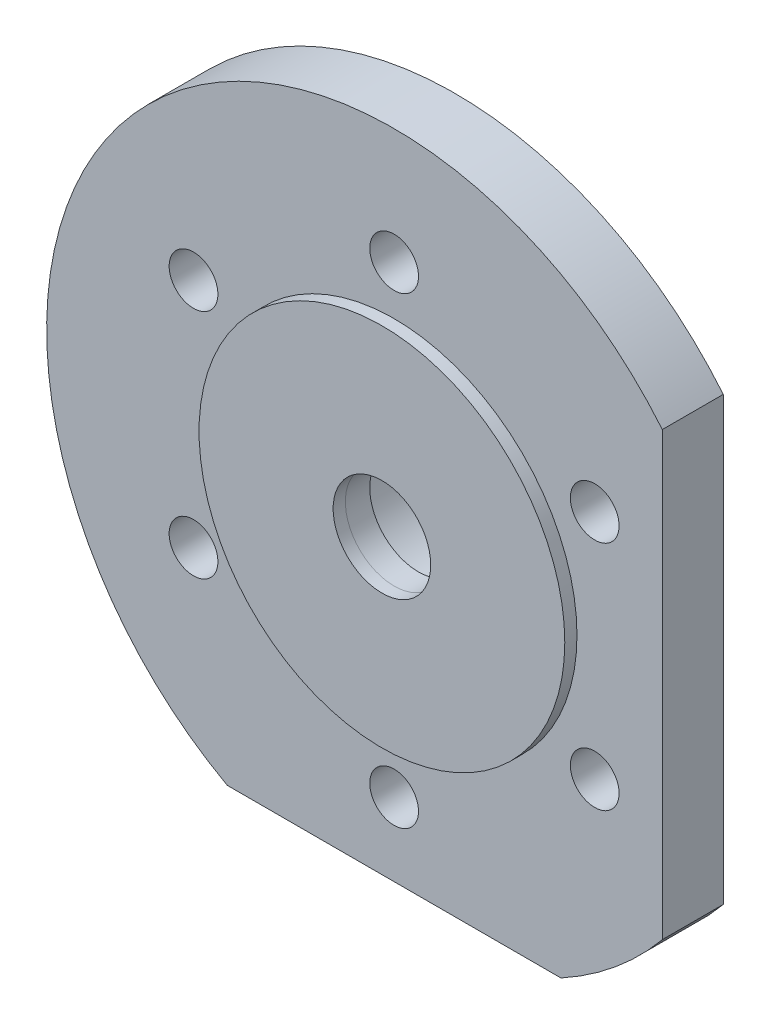
ISO-10303-21;
HEADER;
FILE_DESCRIPTION(('STEP AP214'),'2;1');
FILE_NAME('part.step','',(''),(''),'','','');
FILE_SCHEMA(('AUTOMOTIVE_DESIGN { 1 0 10303 214 1 1 1 1 }'));
ENDSEC;
DATA;
#1=APPLICATION_CONTEXT('core data for automotive mechanical design processes');
#2=APPLICATION_PROTOCOL_DEFINITION('international standard','automotive_design',2000,#1);
#3=PRODUCT_CONTEXT('',#1,'mechanical');
#4=PRODUCT('Part','Part','',(#3));
#5=PRODUCT_RELATED_PRODUCT_CATEGORY('part','',(#4));
#6=PRODUCT_DEFINITION_FORMATION('','',#4);
#7=PRODUCT_DEFINITION_CONTEXT('part definition',#1,'design');
#8=PRODUCT_DEFINITION('design','',#6,#7);
#9=PRODUCT_DEFINITION_SHAPE('','',#8);
#10=(LENGTH_UNIT() NAMED_UNIT(*) SI_UNIT(.MILLI.,.METRE.));
#11=(NAMED_UNIT(*) PLANE_ANGLE_UNIT() SI_UNIT($,.RADIAN.));
#12=(NAMED_UNIT(*) SI_UNIT($,.STERADIAN.) SOLID_ANGLE_UNIT());
#13=UNCERTAINTY_MEASURE_WITH_UNIT(LENGTH_MEASURE(1.E-05),#10,'distance_accuracy_value','');
#14=(GEOMETRIC_REPRESENTATION_CONTEXT(3) GLOBAL_UNCERTAINTY_ASSIGNED_CONTEXT((#13)) GLOBAL_UNIT_ASSIGNED_CONTEXT((#10,
#11,#12)) REPRESENTATION_CONTEXT('',''));
#15=CARTESIAN_POINT('',(0.,0.,0.));
#16=DIRECTION('',(0.,0.,1.));
#17=DIRECTION('',(1.,0.,0.));
#18=AXIS2_PLACEMENT_3D('',#15,#16,#17);
#19=CARTESIAN_POINT('',(0.,0.,-12.));
#20=DIRECTION('',(0.,0.,1.));
#21=DIRECTION('',(1.,0.,0.));
#22=AXIS2_PLACEMENT_3D('',#19,#20,#21);
#23=CYLINDRICAL_SURFACE('',#22,6.);
#24=CARTESIAN_POINT('',(0.,0.,-12.));
#25=DIRECTION('',(0.,0.,1.));
#26=DIRECTION('',(1.,0.,0.));
#27=AXIS2_PLACEMENT_3D('',#24,#25,#26);
#28=CIRCLE('',#27,6.);
#29=CARTESIAN_POINT('',(6.,0.,-12.));
#30=VERTEX_POINT('',#29);
#31=EDGE_CURVE('E244',#30,#30,#28,.T.);
#32=ORIENTED_EDGE('',*,*,#31,.F.);
#33=EDGE_LOOP('',(#32));
#34=FACE_BOUND('',#33,.T.);
#35=CARTESIAN_POINT('',(0.,0.,-2.));
#36=DIRECTION('',(0.,0.,1.));
#37=DIRECTION('',(1.,0.,0.));
#38=AXIS2_PLACEMENT_3D('',#35,#36,#37);
#39=CIRCLE('',#38,6.);
#40=CARTESIAN_POINT('',(6.,0.,-2.));
#41=VERTEX_POINT('',#40);
#42=EDGE_CURVE('E12',#41,#41,#39,.F.);
#43=ORIENTED_EDGE('',*,*,#42,.F.);
#44=EDGE_LOOP('',(#43));
#45=FACE_BOUND('',#44,.T.);
#46=ADVANCED_FACE('F46',(#34,#45),#23,.F.);
#47=CARTESIAN_POINT('',(0.,-25.,-5.));
#48=DIRECTION('',(0.,1.,0.));
#49=DIRECTION('',(0.,0.,1.));
#50=AXIS2_PLACEMENT_3D('',#47,#48,#49);
#51=PLANE('',#50);
#52=DIRECTION('',(-1.,0.,0.));
#53=VECTOR('',#52,1.);
#54=CARTESIAN_POINT('',(0.,-25.,0.));
#55=LINE('',#54,#53);
#56=CARTESIAN_POINT('',(13.683932183404,-25.,0.));
#57=VERTEX_POINT('',#56);
#58=CARTESIAN_POINT('',(-13.683932183404,-25.,0.));
#59=VERTEX_POINT('',#58);
#60=EDGE_CURVE('E132',#57,#59,#55,.T.);
#61=ORIENTED_EDGE('',*,*,#60,.T.);
#62=DIRECTION('',(0.,0.,1.));
#63=VECTOR('',#62,1.);
#64=CARTESIAN_POINT('',(-13.683932183404,-25.,-5.));
#65=LINE('',#64,#63);
#66=CARTESIAN_POINT('',(-13.683932183404,-25.,-5.));
#67=VERTEX_POINT('',#66);
#68=EDGE_CURVE('E55',#67,#59,#65,.T.);
#69=ORIENTED_EDGE('',*,*,#68,.F.);
#70=DIRECTION('',(-1.,0.,0.));
#71=VECTOR('',#70,1.);
#72=CARTESIAN_POINT('',(0.,-25.,-5.));
#73=LINE('',#72,#71);
#74=CARTESIAN_POINT('',(13.683932183404,-25.,-5.));
#75=VERTEX_POINT('',#74);
#76=EDGE_CURVE('E63',#75,#67,#73,.T.);
#77=ORIENTED_EDGE('',*,*,#76,.F.);
#78=DIRECTION('',(0.,0.,1.));
#79=VECTOR('',#78,1.);
#80=CARTESIAN_POINT('',(13.683932183404,-25.,-5.));
#81=LINE('',#80,#79);
#82=EDGE_CURVE('E93',#75,#57,#81,.T.);
#83=ORIENTED_EDGE('',*,*,#82,.T.);
#84=EDGE_LOOP('',(#61,#69,#77,#83));
#85=FACE_BOUND('',#84,.T.);
#86=ADVANCED_FACE('F144',(#85),#51,.F.);
#87=CARTESIAN_POINT('',(0.,0.,-5.));
#88=DIRECTION('',(0.,0.,1.));
#89=DIRECTION('',(1.,0.,0.));
#90=AXIS2_PLACEMENT_3D('',#87,#88,#89);
#91=CYLINDRICAL_SURFACE('',#90,28.5);
#92=CARTESIAN_POINT('',(0.,0.,0.));
#93=DIRECTION('',(0.,0.,1.));
#94=DIRECTION('',(1.,0.,0.));
#95=AXIS2_PLACEMENT_3D('',#92,#93,#94);
#96=CIRCLE('',#95,28.5);
#97=CARTESIAN_POINT('',(22.,18.1176709319934,0.));
#98=VERTEX_POINT('',#97);
#99=EDGE_CURVE('E137',#98,#59,#96,.T.);
#100=ORIENTED_EDGE('',*,*,#99,.F.);
#101=DIRECTION('',(0.,0.,1.));
#102=VECTOR('',#101,1.);
#103=CARTESIAN_POINT('',(22.,18.1176709319934,-5.));
#104=LINE('',#103,#102);
#105=CARTESIAN_POINT('',(22.,18.1176709319934,-5.));
#106=VERTEX_POINT('',#105);
#107=EDGE_CURVE('E80',#106,#98,#104,.T.);
#108=ORIENTED_EDGE('',*,*,#107,.F.);
#109=CARTESIAN_POINT('',(0.,0.,-5.));
#110=DIRECTION('',(0.,0.,1.));
#111=DIRECTION('',(1.,0.,0.));
#112=AXIS2_PLACEMENT_3D('',#109,#110,#111);
#113=CIRCLE('',#112,28.5);
#114=EDGE_CURVE('E99',#106,#67,#113,.T.);
#115=ORIENTED_EDGE('',*,*,#114,.T.);
#116=ORIENTED_EDGE('',*,*,#68,.T.);
#117=EDGE_LOOP('',(#100,#108,#115,#116));
#118=FACE_BOUND('',#117,.T.);
#119=ADVANCED_FACE('F148',(#118),#91,.T.);
#120=CARTESIAN_POINT('',(22.,0.,-5.));
#121=DIRECTION('',(-1.,0.,0.));
#122=DIRECTION('',(0.,0.,1.));
#123=AXIS2_PLACEMENT_3D('',#120,#121,#122);
#124=PLANE('',#123);
#125=DIRECTION('',(0.,-1.,0.));
#126=VECTOR('',#125,1.);
#127=CARTESIAN_POINT('',(22.,0.,0.));
#128=LINE('',#127,#126);
#129=CARTESIAN_POINT('',(22.,-18.1176709319934,0.));
#130=VERTEX_POINT('',#129);
#131=EDGE_CURVE('E103',#98,#130,#128,.T.);
#132=ORIENTED_EDGE('',*,*,#131,.T.);
#133=DIRECTION('',(0.,0.,1.));
#134=VECTOR('',#133,1.);
#135=CARTESIAN_POINT('',(22.,-18.1176709319934,-5.));
#136=LINE('',#135,#134);
#137=CARTESIAN_POINT('',(22.,-18.1176709319934,-5.));
#138=VERTEX_POINT('',#137);
#139=EDGE_CURVE('E101',#138,#130,#136,.T.);
#140=ORIENTED_EDGE('',*,*,#139,.F.);
#141=DIRECTION('',(0.,-1.,0.));
#142=VECTOR('',#141,1.);
#143=CARTESIAN_POINT('',(22.,0.,-5.));
#144=LINE('',#143,#142);
#145=EDGE_CURVE('E95',#106,#138,#144,.T.);
#146=ORIENTED_EDGE('',*,*,#145,.F.);
#147=ORIENTED_EDGE('',*,*,#107,.T.);
#148=EDGE_LOOP('',(#132,#140,#146,#147));
#149=FACE_BOUND('',#148,.T.);
#150=ADVANCED_FACE('F102',(#149),#124,.F.);
#151=CARTESIAN_POINT('',(0.,19.,-5.));
#152=DIRECTION('',(0.,0.,1.));
#153=DIRECTION('',(1.,0.,0.));
#154=AXIS2_PLACEMENT_3D('',#151,#152,#153);
#155=CYLINDRICAL_SURFACE('',#154,2.);
#156=CARTESIAN_POINT('',(0.,19.,-5.));
#157=DIRECTION('',(0.,0.,1.));
#158=DIRECTION('',(1.,0.,0.));
#159=AXIS2_PLACEMENT_3D('',#156,#157,#158);
#160=CIRCLE('',#159,2.);
#161=CARTESIAN_POINT('',(2.,19.,-5.));
#162=VERTEX_POINT('',#161);
#163=EDGE_CURVE('E108',#162,#162,#160,.T.);
#164=ORIENTED_EDGE('',*,*,#163,.F.);
#165=EDGE_LOOP('',(#164));
#166=FACE_BOUND('',#165,.T.);
#167=CARTESIAN_POINT('',(0.,19.,0.));
#168=DIRECTION('',(0.,0.,1.));
#169=DIRECTION('',(1.,0.,0.));
#170=AXIS2_PLACEMENT_3D('',#167,#168,#169);
#171=CIRCLE('',#170,2.);
#172=CARTESIAN_POINT('',(2.,19.,0.));
#173=VERTEX_POINT('',#172);
#174=EDGE_CURVE('E129',#173,#173,#171,.T.);
#175=ORIENTED_EDGE('',*,*,#174,.T.);
#176=EDGE_LOOP('',(#175));
#177=FACE_BOUND('',#176,.T.);
#178=ADVANCED_FACE('F155',(#166,#177),#155,.F.);
#179=CARTESIAN_POINT('',(16.4544826719043,9.50000000000001,-5.));
#180=DIRECTION('',(0.,0.,1.));
#181=DIRECTION('',(1.,0.,0.));
#182=AXIS2_PLACEMENT_3D('',#179,#180,#181);
#183=CYLINDRICAL_SURFACE('',#182,2.00000000000001);
#184=CARTESIAN_POINT('',(16.4544826719043,9.50000000000001,-5.));
#185=DIRECTION('',(0.,0.,1.));
#186=DIRECTION('',(1.,0.,0.));
#187=AXIS2_PLACEMENT_3D('',#184,#185,#186);
#188=CIRCLE('',#187,2.00000000000001);
#189=CARTESIAN_POINT('',(18.4544826719043,9.50000000000001,-5.));
#190=VERTEX_POINT('',#189);
#191=EDGE_CURVE('E234',#190,#190,#188,.T.);
#192=ORIENTED_EDGE('',*,*,#191,.F.);
#193=EDGE_LOOP('',(#192));
#194=FACE_BOUND('',#193,.T.);
#195=CARTESIAN_POINT('',(16.4544826719043,9.50000000000001,0.));
#196=DIRECTION('',(0.,0.,1.));
#197=DIRECTION('',(1.,0.,0.));
#198=AXIS2_PLACEMENT_3D('',#195,#196,#197);
#199=CIRCLE('',#198,2.00000000000001);
#200=CARTESIAN_POINT('',(18.4544826719043,9.50000000000001,0.));
#201=VERTEX_POINT('',#200);
#202=EDGE_CURVE('E126',#201,#201,#199,.T.);
#203=ORIENTED_EDGE('',*,*,#202,.T.);
#204=EDGE_LOOP('',(#203));
#205=FACE_BOUND('',#204,.T.);
#206=ADVANCED_FACE('F193',(#194,#205),#183,.F.);
#207=CARTESIAN_POINT('',(16.4544826719043,-9.5,-5.));
#208=DIRECTION('',(0.,0.,1.));
#209=DIRECTION('',(1.,0.,0.));
#210=AXIS2_PLACEMENT_3D('',#207,#208,#209);
#211=CYLINDRICAL_SURFACE('',#210,2.);
#212=CARTESIAN_POINT('',(16.4544826719043,-9.5,-5.));
#213=DIRECTION('',(0.,0.,1.));
#214=DIRECTION('',(1.,0.,0.));
#215=AXIS2_PLACEMENT_3D('',#212,#213,#214);
#216=CIRCLE('',#215,2.);
#217=CARTESIAN_POINT('',(18.4544826719043,-9.5,-5.));
#218=VERTEX_POINT('',#217);
#219=EDGE_CURVE('E226',#218,#218,#216,.T.);
#220=ORIENTED_EDGE('',*,*,#219,.F.);
#221=EDGE_LOOP('',(#220));
#222=FACE_BOUND('',#221,.T.);
#223=CARTESIAN_POINT('',(16.4544826719043,-9.5,0.));
#224=DIRECTION('',(0.,0.,1.));
#225=DIRECTION('',(1.,0.,0.));
#226=AXIS2_PLACEMENT_3D('',#223,#224,#225);
#227=CIRCLE('',#226,2.);
#228=CARTESIAN_POINT('',(18.4544826719043,-9.5,0.));
#229=VERTEX_POINT('',#228);
#230=EDGE_CURVE('E123',#229,#229,#227,.T.);
#231=ORIENTED_EDGE('',*,*,#230,.T.);
#232=EDGE_LOOP('',(#231));
#233=FACE_BOUND('',#232,.T.);
#234=ADVANCED_FACE('F199',(#222,#233),#211,.F.);
#235=CARTESIAN_POINT('',(0.,-19.,-5.));
#236=DIRECTION('',(0.,0.,1.));
#237=DIRECTION('',(1.,0.,0.));
#238=AXIS2_PLACEMENT_3D('',#235,#236,#237);
#239=CYLINDRICAL_SURFACE('',#238,2.);
#240=CARTESIAN_POINT('',(0.,-19.,-5.));
#241=DIRECTION('',(0.,0.,1.));
#242=DIRECTION('',(1.,0.,0.));
#243=AXIS2_PLACEMENT_3D('',#240,#241,#242);
#244=CIRCLE('',#243,2.);
#245=CARTESIAN_POINT('',(2.,-19.,-5.));
#246=VERTEX_POINT('',#245);
#247=EDGE_CURVE('E223',#246,#246,#244,.T.);
#248=ORIENTED_EDGE('',*,*,#247,.F.);
#249=EDGE_LOOP('',(#248));
#250=FACE_BOUND('',#249,.T.);
#251=CARTESIAN_POINT('',(0.,-19.,0.));
#252=DIRECTION('',(0.,0.,1.));
#253=DIRECTION('',(1.,0.,0.));
#254=AXIS2_PLACEMENT_3D('',#251,#252,#253);
#255=CIRCLE('',#254,2.);
#256=CARTESIAN_POINT('',(2.,-19.,0.));
#257=VERTEX_POINT('',#256);
#258=EDGE_CURVE('E120',#257,#257,#255,.T.);
#259=ORIENTED_EDGE('',*,*,#258,.T.);
#260=EDGE_LOOP('',(#259));
#261=FACE_BOUND('',#260,.T.);
#262=ADVANCED_FACE('F207',(#250,#261),#239,.F.);
#263=CARTESIAN_POINT('',(-16.4544826719043,-9.50000000000001,-5.));
#264=DIRECTION('',(0.,0.,1.));
#265=DIRECTION('',(1.,0.,0.));
#266=AXIS2_PLACEMENT_3D('',#263,#264,#265);
#267=CYLINDRICAL_SURFACE('',#266,2.);
#268=CARTESIAN_POINT('',(-16.4544826719043,-9.50000000000001,-5.));
#269=DIRECTION('',(0.,0.,1.));
#270=DIRECTION('',(1.,0.,0.));
#271=AXIS2_PLACEMENT_3D('',#268,#269,#270);
#272=CIRCLE('',#271,2.);
#273=CARTESIAN_POINT('',(-14.4544826719043,-9.50000000000001,-5.));
#274=VERTEX_POINT('',#273);
#275=EDGE_CURVE('E221',#274,#274,#272,.T.);
#276=ORIENTED_EDGE('',*,*,#275,.F.);
#277=EDGE_LOOP('',(#276));
#278=FACE_BOUND('',#277,.T.);
#279=CARTESIAN_POINT('',(-16.4544826719043,-9.50000000000001,0.));
#280=DIRECTION('',(0.,0.,1.));
#281=DIRECTION('',(1.,0.,0.));
#282=AXIS2_PLACEMENT_3D('',#279,#280,#281);
#283=CIRCLE('',#282,2.);
#284=CARTESIAN_POINT('',(-14.4544826719043,-9.50000000000001,0.));
#285=VERTEX_POINT('',#284);
#286=EDGE_CURVE('E116',#285,#285,#283,.T.);
#287=ORIENTED_EDGE('',*,*,#286,.T.);
#288=EDGE_LOOP('',(#287));
#289=FACE_BOUND('',#288,.T.);
#290=ADVANCED_FACE('F210',(#278,#289),#267,.F.);
#291=CARTESIAN_POINT('',(-16.4544826719043,9.49999999999999,-5.));
#292=DIRECTION('',(0.,0.,1.));
#293=DIRECTION('',(1.,0.,0.));
#294=AXIS2_PLACEMENT_3D('',#291,#292,#293);
#295=CYLINDRICAL_SURFACE('',#294,2.);
#296=CARTESIAN_POINT('',(-16.4544826719043,9.49999999999999,-5.));
#297=DIRECTION('',(0.,0.,1.));
#298=DIRECTION('',(1.,0.,0.));
#299=AXIS2_PLACEMENT_3D('',#296,#297,#298);
#300=CIRCLE('',#299,2.);
#301=CARTESIAN_POINT('',(-14.4544826719043,9.49999999999999,-5.));
#302=VERTEX_POINT('',#301);
#303=EDGE_CURVE('E140',#302,#302,#300,.T.);
#304=ORIENTED_EDGE('',*,*,#303,.F.);
#305=EDGE_LOOP('',(#304));
#306=FACE_BOUND('',#305,.T.);
#307=CARTESIAN_POINT('',(-16.4544826719043,9.49999999999999,0.));
#308=DIRECTION('',(0.,0.,1.));
#309=DIRECTION('',(1.,0.,0.));
#310=AXIS2_PLACEMENT_3D('',#307,#308,#309);
#311=CIRCLE('',#310,2.);
#312=CARTESIAN_POINT('',(-14.4544826719043,9.49999999999999,0.));
#313=VERTEX_POINT('',#312);
#314=EDGE_CURVE('E113',#313,#313,#311,.T.);
#315=ORIENTED_EDGE('',*,*,#314,.T.);
#316=EDGE_LOOP('',(#315));
#317=FACE_BOUND('',#316,.T.);
#318=ADVANCED_FACE('F48',(#306,#317),#295,.F.);
#319=CARTESIAN_POINT('',(0.,0.,-5.));
#320=DIRECTION('',(0.,0.,1.));
#321=DIRECTION('',(1.,0.,0.));
#322=AXIS2_PLACEMENT_3D('',#319,#320,#321);
#323=CYLINDRICAL_SURFACE('',#322,28.5);
#324=CARTESIAN_POINT('',(0.,0.,0.));
#325=DIRECTION('',(0.,0.,1.));
#326=DIRECTION('',(1.,0.,0.));
#327=AXIS2_PLACEMENT_3D('',#324,#325,#326);
#328=CIRCLE('',#327,28.5);
#329=EDGE_CURVE('E134',#57,#130,#328,.T.);
#330=ORIENTED_EDGE('',*,*,#329,.F.);
#331=ORIENTED_EDGE('',*,*,#82,.F.);
#332=CARTESIAN_POINT('',(0.,0.,-5.));
#333=DIRECTION('',(0.,0.,1.));
#334=DIRECTION('',(1.,0.,0.));
#335=AXIS2_PLACEMENT_3D('',#332,#333,#334);
#336=CIRCLE('',#335,28.5);
#337=EDGE_CURVE('E98',#75,#138,#336,.T.);
#338=ORIENTED_EDGE('',*,*,#337,.T.);
#339=ORIENTED_EDGE('',*,*,#139,.T.);
#340=EDGE_LOOP('',(#330,#331,#338,#339));
#341=FACE_BOUND('',#340,.T.);
#342=ADVANCED_FACE('F106',(#341),#323,.T.);
#343=CARTESIAN_POINT('',(0.,0.,-5.));
#344=DIRECTION('',(0.,0.,1.));
#345=DIRECTION('',(1.,0.,0.));
#346=AXIS2_PLACEMENT_3D('',#343,#344,#345);
#347=PLANE('',#346);
#348=ORIENTED_EDGE('',*,*,#303,.T.);
#349=EDGE_LOOP('',(#348));
#350=FACE_BOUND('',#349,.T.);
#351=ORIENTED_EDGE('',*,*,#275,.T.);
#352=EDGE_LOOP('',(#351));
#353=FACE_BOUND('',#352,.T.);
#354=ORIENTED_EDGE('',*,*,#247,.T.);
#355=EDGE_LOOP('',(#354));
#356=FACE_BOUND('',#355,.T.);
#357=ORIENTED_EDGE('',*,*,#219,.T.);
#358=EDGE_LOOP('',(#357));
#359=FACE_BOUND('',#358,.T.);
#360=ORIENTED_EDGE('',*,*,#191,.T.);
#361=EDGE_LOOP('',(#360));
#362=FACE_BOUND('',#361,.T.);
#363=ORIENTED_EDGE('',*,*,#163,.T.);
#364=EDGE_LOOP('',(#363));
#365=FACE_BOUND('',#364,.T.);
#366=CARTESIAN_POINT('',(0.,0.,-5.));
#367=DIRECTION('',(0.,0.,1.));
#368=DIRECTION('',(1.,0.,0.));
#369=AXIS2_PLACEMENT_3D('',#366,#367,#368);
#370=CIRCLE('',#369,15.);
#371=CARTESIAN_POINT('',(15.,0.,-5.));
#372=VERTEX_POINT('',#371);
#373=EDGE_CURVE('E117',#372,#372,#370,.T.);
#374=ORIENTED_EDGE('',*,*,#373,.T.);
#375=EDGE_LOOP('',(#374));
#376=FACE_BOUND('',#375,.T.);
#377=ORIENTED_EDGE('',*,*,#76,.T.);
#378=ORIENTED_EDGE('',*,*,#114,.F.);
#379=ORIENTED_EDGE('',*,*,#145,.T.);
#380=ORIENTED_EDGE('',*,*,#337,.F.);
#381=EDGE_LOOP('',(#377,#378,#379,#380));
#382=FACE_BOUND('',#381,.T.);
#383=ADVANCED_FACE('F97',(#350,#353,#356,#359,#362,#365,#376,#382),#347,.F.);
#384=CARTESIAN_POINT('',(0.,0.,0.));
#385=DIRECTION('',(0.,0.,1.));
#386=DIRECTION('',(1.,0.,0.));
#387=AXIS2_PLACEMENT_3D('',#384,#385,#386);
#388=PLANE('',#387);
#389=ORIENTED_EDGE('',*,*,#314,.F.);
#390=EDGE_LOOP('',(#389));
#391=FACE_BOUND('',#390,.T.);
#392=ORIENTED_EDGE('',*,*,#286,.F.);
#393=EDGE_LOOP('',(#392));
#394=FACE_BOUND('',#393,.T.);
#395=ORIENTED_EDGE('',*,*,#258,.F.);
#396=EDGE_LOOP('',(#395));
#397=FACE_BOUND('',#396,.T.);
#398=ORIENTED_EDGE('',*,*,#230,.F.);
#399=EDGE_LOOP('',(#398));
#400=FACE_BOUND('',#399,.T.);
#401=ORIENTED_EDGE('',*,*,#202,.F.);
#402=EDGE_LOOP('',(#401));
#403=FACE_BOUND('',#402,.T.);
#404=ORIENTED_EDGE('',*,*,#174,.F.);
#405=EDGE_LOOP('',(#404));
#406=FACE_BOUND('',#405,.T.);
#407=ORIENTED_EDGE('',*,*,#60,.F.);
#408=ORIENTED_EDGE('',*,*,#329,.T.);
#409=ORIENTED_EDGE('',*,*,#131,.F.);
#410=ORIENTED_EDGE('',*,*,#99,.T.);
#411=EDGE_LOOP('',(#407,#408,#409,#410));
#412=FACE_BOUND('',#411,.T.);
#413=CARTESIAN_POINT('',(0.,0.,0.));
#414=DIRECTION('',(0.,0.,1.));
#415=DIRECTION('',(1.,0.,0.));
#416=AXIS2_PLACEMENT_3D('',#413,#414,#415);
#417=CIRCLE('',#416,4.);
#418=CARTESIAN_POINT('',(4.,0.,0.));
#419=VERTEX_POINT('',#418);
#420=EDGE_CURVE('E250',#419,#419,#417,.T.);
#421=ORIENTED_EDGE('',*,*,#420,.F.);
#422=EDGE_LOOP('',(#421));
#423=FACE_BOUND('',#422,.T.);
#424=ADVANCED_FACE('F146',(#391,#394,#397,#400,#403,#406,#412,#423),#388,.T.);
#425=CARTESIAN_POINT('',(0.,0.,-12.));
#426=DIRECTION('',(0.,0.,1.));
#427=DIRECTION('',(1.,0.,0.));
#428=AXIS2_PLACEMENT_3D('',#425,#426,#427);
#429=CYLINDRICAL_SURFACE('',#428,15.);
#430=CARTESIAN_POINT('',(0.,0.,-12.));
#431=DIRECTION('',(0.,0.,1.));
#432=DIRECTION('',(1.,0.,0.));
#433=AXIS2_PLACEMENT_3D('',#430,#431,#432);
#434=CIRCLE('',#433,15.);
#435=CARTESIAN_POINT('',(15.,0.,-12.));
#436=VERTEX_POINT('',#435);
#437=EDGE_CURVE('E242',#436,#436,#434,.T.);
#438=ORIENTED_EDGE('',*,*,#437,.T.);
#439=EDGE_LOOP('',(#438));
#440=FACE_BOUND('',#439,.T.);
#441=ORIENTED_EDGE('',*,*,#373,.F.);
#442=EDGE_LOOP('',(#441));
#443=FACE_BOUND('',#442,.T.);
#444=ADVANCED_FACE('F169',(#440,#443),#429,.T.);
#445=CARTESIAN_POINT('',(0.,0.,-12.));
#446=DIRECTION('',(0.,0.,1.));
#447=DIRECTION('',(1.,0.,0.));
#448=AXIS2_PLACEMENT_3D('',#445,#446,#447);
#449=PLANE('',#448);
#450=ORIENTED_EDGE('',*,*,#31,.T.);
#451=EDGE_LOOP('',(#450));
#452=FACE_BOUND('',#451,.T.);
#453=ORIENTED_EDGE('',*,*,#437,.F.);
#454=EDGE_LOOP('',(#453));
#455=FACE_BOUND('',#454,.T.);
#456=ADVANCED_FACE('F178',(#452,#455),#449,.F.);
#457=CARTESIAN_POINT('',(0.,0.,-2.));
#458=DIRECTION('',(0.,0.,1.));
#459=DIRECTION('',(1.,0.,0.));
#460=AXIS2_PLACEMENT_3D('',#457,#458,#459);
#461=CYLINDRICAL_SURFACE('',#460,4.);
#462=CARTESIAN_POINT('',(0.,0.,-2.));
#463=DIRECTION('',(0.,0.,1.));
#464=DIRECTION('',(1.,0.,0.));
#465=AXIS2_PLACEMENT_3D('',#462,#463,#464);
#466=CIRCLE('',#465,4.);
#467=CARTESIAN_POINT('',(4.,0.,-2.));
#468=VERTEX_POINT('',#467);
#469=EDGE_CURVE('E249',#468,#468,#466,.T.);
#470=ORIENTED_EDGE('',*,*,#469,.F.);
#471=EDGE_LOOP('',(#470));
#472=FACE_BOUND('',#471,.T.);
#473=ORIENTED_EDGE('',*,*,#420,.T.);
#474=EDGE_LOOP('',(#473));
#475=FACE_BOUND('',#474,.T.);
#476=ADVANCED_FACE('F259',(#472,#475),#461,.F.);
#477=CARTESIAN_POINT('',(0.,0.,-2.));
#478=DIRECTION('',(0.,0.,1.));
#479=DIRECTION('',(1.,0.,0.));
#480=AXIS2_PLACEMENT_3D('',#477,#478,#479);
#481=PLANE('',#480);
#482=ORIENTED_EDGE('',*,*,#469,.T.);
#483=EDGE_LOOP('',(#482));
#484=FACE_BOUND('',#483,.T.);
#485=ORIENTED_EDGE('',*,*,#42,.T.);
#486=EDGE_LOOP('',(#485));
#487=FACE_BOUND('',#486,.T.);
#488=ADVANCED_FACE('F256',(#484,#487),#481,.F.);
#489=CLOSED_SHELL('',(#46,#86,#119,#150,#178,#206,#234,#262,#290,#318,#342,#383,#424,#444,#456,
#476,#488));
#490=MANIFOLD_SOLID_BREP('B2',#489);
#491=CARTESIAN_POINT('',(0.,0.,1.));
#492=DIRECTION('',(0.,0.,-1.));
#493=DIRECTION('',(-1.,0.,0.));
#494=AXIS2_PLACEMENT_3D('',#491,#492,#493);
#495=CYLINDRICAL_SURFACE('',#494,15.);
#496=CARTESIAN_POINT('',(0.,0.,1.));
#497=DIRECTION('',(0.,0.,1.));
#498=DIRECTION('',(1.,0.,0.));
#499=AXIS2_PLACEMENT_3D('',#496,#497,#498);
#500=CIRCLE('',#499,15.);
#501=CARTESIAN_POINT('',(15.,0.,1.));
#502=VERTEX_POINT('',#501);
#503=EDGE_CURVE('E397',#502,#502,#500,.T.);
#504=ORIENTED_EDGE('',*,*,#503,.F.);
#505=EDGE_LOOP('',(#504));
#506=FACE_BOUND('',#505,.T.);
#507=CARTESIAN_POINT('',(0.,0.,0.));
#508=DIRECTION('',(0.,0.,1.));
#509=DIRECTION('',(1.,0.,0.));
#510=AXIS2_PLACEMENT_3D('',#507,#508,#509);
#511=CIRCLE('',#510,15.);
#512=CARTESIAN_POINT('',(15.,0.,0.));
#513=VERTEX_POINT('',#512);
#514=EDGE_CURVE('E403',#513,#513,#511,.T.);
#515=ORIENTED_EDGE('',*,*,#514,.T.);
#516=EDGE_LOOP('',(#515));
#517=FACE_BOUND('',#516,.T.);
#518=ADVANCED_FACE('F390',(#506,#517),#495,.T.);
#519=CARTESIAN_POINT('',(0.,0.,1.));
#520=DIRECTION('',(0.,0.,-1.));
#521=DIRECTION('',(-1.,0.,0.));
#522=AXIS2_PLACEMENT_3D('',#519,#520,#521);
#523=CYLINDRICAL_SURFACE('',#522,4.);
#524=CARTESIAN_POINT('',(0.,0.,1.));
#525=DIRECTION('',(0.,0.,1.));
#526=DIRECTION('',(1.,0.,0.));
#527=AXIS2_PLACEMENT_3D('',#524,#525,#526);
#528=CIRCLE('',#527,4.);
#529=CARTESIAN_POINT('',(4.,0.,1.));
#530=VERTEX_POINT('',#529);
#531=EDGE_CURVE('E45',#530,#530,#528,.T.);
#532=ORIENTED_EDGE('',*,*,#531,.T.);
#533=EDGE_LOOP('',(#532));
#534=FACE_BOUND('',#533,.T.);
#535=CARTESIAN_POINT('',(0.,0.,0.));
#536=DIRECTION('',(0.,0.,1.));
#537=DIRECTION('',(1.,0.,0.));
#538=AXIS2_PLACEMENT_3D('',#535,#536,#537);
#539=CIRCLE('',#538,4.);
#540=CARTESIAN_POINT('',(4.,0.,0.));
#541=VERTEX_POINT('',#540);
#542=EDGE_CURVE('E393',#541,#541,#539,.T.);
#543=ORIENTED_EDGE('',*,*,#542,.F.);
#544=EDGE_LOOP('',(#543));
#545=FACE_BOUND('',#544,.T.);
#546=ADVANCED_FACE('F412',(#534,#545),#523,.F.);
#547=CARTESIAN_POINT('',(0.,0.,1.));
#548=DIRECTION('',(0.,0.,1.));
#549=DIRECTION('',(1.,0.,0.));
#550=AXIS2_PLACEMENT_3D('',#547,#548,#549);
#551=PLANE('',#550);
#552=ORIENTED_EDGE('',*,*,#503,.T.);
#553=EDGE_LOOP('',(#552));
#554=FACE_BOUND('',#553,.T.);
#555=ORIENTED_EDGE('',*,*,#531,.F.);
#556=EDGE_LOOP('',(#555));
#557=FACE_BOUND('',#556,.T.);
#558=ADVANCED_FACE('F414',(#554,#557),#551,.T.);
#559=CARTESIAN_POINT('',(0.,0.,0.));
#560=DIRECTION('',(0.,0.,1.));
#561=DIRECTION('',(1.,0.,0.));
#562=AXIS2_PLACEMENT_3D('',#559,#560,#561);
#563=PLANE('',#562);
#564=ORIENTED_EDGE('',*,*,#514,.F.);
#565=EDGE_LOOP('',(#564));
#566=FACE_BOUND('',#565,.T.);
#567=ORIENTED_EDGE('',*,*,#542,.T.);
#568=EDGE_LOOP('',(#567));
#569=FACE_BOUND('',#568,.T.);
#570=ADVANCED_FACE('F410',(#566,#569),#563,.F.);
#571=CLOSED_SHELL('',(#518,#546,#558,#570));
#572=MANIFOLD_SOLID_BREP('B6',#571);
#573=ADVANCED_BREP_SHAPE_REPRESENTATION('',(#18,#490,#572),#14);
#574=SHAPE_DEFINITION_REPRESENTATION(#9,#573);
ENDSEC;
END-ISO-10303-21;
